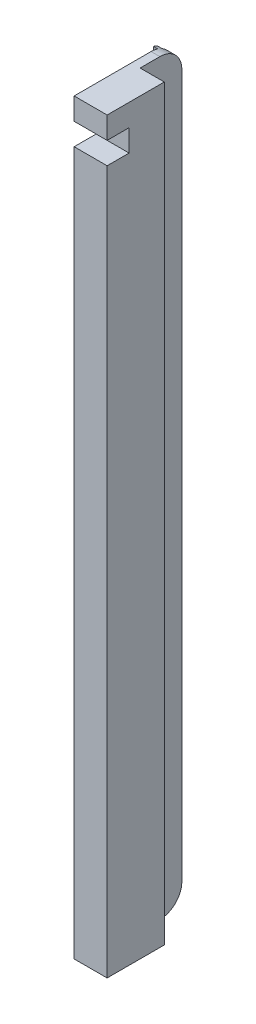
ISO-10303-21;
HEADER;
FILE_DESCRIPTION(('STEP AP214'),'2;1');
FILE_NAME('part.step','',(''),(''),'','','');
FILE_SCHEMA(('AUTOMOTIVE_DESIGN { 1 0 10303 214 1 1 1 1 }'));
ENDSEC;
DATA;
#1=APPLICATION_CONTEXT('core data for automotive mechanical design processes');
#2=APPLICATION_PROTOCOL_DEFINITION('international standard','automotive_design',2000,#1);
#3=PRODUCT_CONTEXT('',#1,'mechanical');
#4=PRODUCT('Part','Part','',(#3));
#5=PRODUCT_RELATED_PRODUCT_CATEGORY('part','',(#4));
#6=PRODUCT_DEFINITION_FORMATION('','',#4);
#7=PRODUCT_DEFINITION_CONTEXT('part definition',#1,'design');
#8=PRODUCT_DEFINITION('design','',#6,#7);
#9=PRODUCT_DEFINITION_SHAPE('','',#8);
#10=(LENGTH_UNIT() NAMED_UNIT(*) SI_UNIT(.MILLI.,.METRE.));
#11=(NAMED_UNIT(*) PLANE_ANGLE_UNIT() SI_UNIT($,.RADIAN.));
#12=(NAMED_UNIT(*) SI_UNIT($,.STERADIAN.) SOLID_ANGLE_UNIT());
#13=UNCERTAINTY_MEASURE_WITH_UNIT(LENGTH_MEASURE(1.E-05),#10,'distance_accuracy_value','');
#14=(GEOMETRIC_REPRESENTATION_CONTEXT(3) GLOBAL_UNCERTAINTY_ASSIGNED_CONTEXT((#13)) GLOBAL_UNIT_ASSIGNED_CONTEXT((#10,
#11,#12)) REPRESENTATION_CONTEXT('',''));
#15=CARTESIAN_POINT('',(0.,0.,0.));
#16=DIRECTION('',(0.,0.,1.));
#17=DIRECTION('',(1.,0.,0.));
#18=AXIS2_PLACEMENT_3D('',#15,#16,#17);
#19=CARTESIAN_POINT('',(168.,-19.9999999999999,26.));
#20=DIRECTION('',(1.,0.,0.));
#21=DIRECTION('',(0.,1.,0.));
#22=AXIS2_PLACEMENT_3D('',#19,#20,#21);
#23=PLANE('',#22);
#24=CARTESIAN_POINT('',(168.,-9.99999999999996,-9.));
#25=DIRECTION('',(1.,0.,0.));
#26=DIRECTION('',(0.,1.,0.));
#27=AXIS2_PLACEMENT_3D('',#24,#25,#26);
#28=CIRCLE('',#27,10.);
#29=CARTESIAN_POINT('',(168.,0.,-9.));
#30=VERTEX_POINT('',#29);
#31=CARTESIAN_POINT('',(168.,-0.460607985830501,-12.));
#32=VERTEX_POINT('',#31);
#33=EDGE_CURVE('E264',#30,#32,#28,.F.);
#34=ORIENTED_EDGE('',*,*,#33,.T.);
#35=DIRECTION('',(0.,-1.,0.));
#36=VECTOR('',#35,1.);
#37=CARTESIAN_POINT('',(168.,0.,-12.));
#38=LINE('',#37,#36);
#39=CARTESIAN_POINT('',(168.,-339.539392014169,-12.));
#40=VERTEX_POINT('',#39);
#41=EDGE_CURVE('E156',#32,#40,#38,.T.);
#42=ORIENTED_EDGE('',*,*,#41,.T.);
#43=CARTESIAN_POINT('',(168.,-330.,-9.));
#44=DIRECTION('',(1.,0.,0.));
#45=DIRECTION('',(0.,1.,0.));
#46=AXIS2_PLACEMENT_3D('',#43,#44,#45);
#47=CIRCLE('',#46,10.);
#48=CARTESIAN_POINT('',(168.,-340.,-8.99999999999998));
#49=VERTEX_POINT('',#48);
#50=EDGE_CURVE('E259',#40,#49,#47,.F.);
#51=ORIENTED_EDGE('',*,*,#50,.T.);
#52=DIRECTION('',(0.,0.,-1.));
#53=VECTOR('',#52,1.);
#54=CARTESIAN_POINT('',(168.,-340.,26.));
#55=LINE('',#54,#53);
#56=CARTESIAN_POINT('',(168.,-340.,26.));
#57=VERTEX_POINT('',#56);
#58=EDGE_CURVE('E240',#57,#49,#55,.T.);
#59=ORIENTED_EDGE('',*,*,#58,.F.);
#60=DIRECTION('',(0.,-1.,0.));
#61=VECTOR('',#60,1.);
#62=CARTESIAN_POINT('',(168.,-19.9999999999999,26.));
#63=LINE('',#62,#61);
#64=CARTESIAN_POINT('',(168.,-19.9999999999999,26.));
#65=VERTEX_POINT('',#64);
#66=EDGE_CURVE('E229',#65,#57,#63,.T.);
#67=ORIENTED_EDGE('',*,*,#66,.F.);
#68=DIRECTION('',(0.,0.,-1.));
#69=VECTOR('',#68,1.);
#70=CARTESIAN_POINT('',(168.,-20.,0.));
#71=LINE('',#70,#69);
#72=CARTESIAN_POINT('',(168.,-20.,15.9999999999999));
#73=VERTEX_POINT('',#72);
#74=EDGE_CURVE('E190',#65,#73,#71,.T.);
#75=ORIENTED_EDGE('',*,*,#74,.T.);
#76=DIRECTION('',(0.,-1.,0.));
#77=VECTOR('',#76,1.);
#78=CARTESIAN_POINT('',(168.,0.,15.9999999999999));
#79=LINE('',#78,#77);
#80=CARTESIAN_POINT('',(168.,-9.99999999999995,15.9999999999999));
#81=VERTEX_POINT('',#80);
#82=EDGE_CURVE('E188',#81,#73,#79,.T.);
#83=ORIENTED_EDGE('',*,*,#82,.F.);
#84=DIRECTION('',(0.,0.,1.));
#85=VECTOR('',#84,1.);
#86=CARTESIAN_POINT('',(168.,-9.99999999999995,0.));
#87=LINE('',#86,#85);
#88=CARTESIAN_POINT('',(168.,-9.99999999999995,26.));
#89=VERTEX_POINT('',#88);
#90=EDGE_CURVE('E160',#81,#89,#87,.T.);
#91=ORIENTED_EDGE('',*,*,#90,.T.);
#92=CARTESIAN_POINT('',(168.,0.,26.));
#93=VERTEX_POINT('',#92);
#94=EDGE_CURVE('E230',#93,#89,#63,.T.);
#95=ORIENTED_EDGE('',*,*,#94,.F.);
#96=DIRECTION('',(0.,0.,1.));
#97=VECTOR('',#96,1.);
#98=CARTESIAN_POINT('',(168.,0.,-19.));
#99=LINE('',#98,#97);
#100=EDGE_CURVE('E211',#30,#93,#99,.T.);
#101=ORIENTED_EDGE('',*,*,#100,.F.);
#102=EDGE_LOOP('',(#34,#42,#51,#59,#67,#75,#83,#91,#95,#101));
#103=FACE_BOUND('',#102,.T.);
#104=ADVANCED_FACE('F35',(#103),#23,.F.);
#105=CARTESIAN_POINT('',(0.,0.,26.));
#106=DIRECTION('',(0.,0.,1.));
#107=DIRECTION('',(1.,0.,0.));
#108=AXIS2_PLACEMENT_3D('',#105,#106,#107);
#109=PLANE('',#108);
#110=ORIENTED_EDGE('',*,*,#94,.T.);
#111=DIRECTION('',(-1.,0.,0.));
#112=VECTOR('',#111,1.);
#113=CARTESIAN_POINT('',(569.,-9.99999999999992,26.));
#114=LINE('',#113,#112);
#115=CARTESIAN_POINT('',(183.,-9.99999999999995,26.));
#116=VERTEX_POINT('',#115);
#117=EDGE_CURVE('E194',#116,#89,#114,.T.);
#118=ORIENTED_EDGE('',*,*,#117,.F.);
#119=DIRECTION('',(0.,-1.,0.));
#120=VECTOR('',#119,1.);
#121=CARTESIAN_POINT('',(183.,0.,26.));
#122=LINE('',#121,#120);
#123=CARTESIAN_POINT('',(183.,0.,26.));
#124=VERTEX_POINT('',#123);
#125=EDGE_CURVE('E223',#124,#116,#122,.T.);
#126=ORIENTED_EDGE('',*,*,#125,.F.);
#127=DIRECTION('',(-1.,0.,0.));
#128=VECTOR('',#127,1.);
#129=CARTESIAN_POINT('',(-168.,0.,26.));
#130=LINE('',#129,#128);
#131=EDGE_CURVE('E218',#124,#93,#130,.T.);
#132=ORIENTED_EDGE('',*,*,#131,.T.);
#133=EDGE_LOOP('',(#110,#118,#126,#132));
#134=FACE_BOUND('',#133,.T.);
#135=ADVANCED_FACE('F297',(#134),#109,.T.);
#136=CARTESIAN_POINT('',(183.,-19.9999999999999,26.));
#137=VERTEX_POINT('',#136);
#138=CARTESIAN_POINT('',(183.,-340.,26.));
#139=VERTEX_POINT('',#138);
#140=EDGE_CURVE('E221',#137,#139,#122,.T.);
#141=ORIENTED_EDGE('',*,*,#140,.F.);
#142=DIRECTION('',(-1.,0.,0.));
#143=VECTOR('',#142,1.);
#144=CARTESIAN_POINT('',(569.,-19.9999999999999,26.));
#145=LINE('',#144,#143);
#146=EDGE_CURVE('E197',#137,#65,#145,.T.);
#147=ORIENTED_EDGE('',*,*,#146,.T.);
#148=ORIENTED_EDGE('',*,*,#66,.T.);
#149=DIRECTION('',(-1.,0.,0.));
#150=VECTOR('',#149,1.);
#151=CARTESIAN_POINT('',(183.,-340.,26.));
#152=LINE('',#151,#150);
#153=EDGE_CURVE('E226',#139,#57,#152,.T.);
#154=ORIENTED_EDGE('',*,*,#153,.F.);
#155=EDGE_LOOP('',(#141,#147,#148,#154));
#156=FACE_BOUND('',#155,.T.);
#157=ADVANCED_FACE('F278',(#156),#109,.T.);
#158=CARTESIAN_POINT('',(168.,-330.,-19.));
#159=VERTEX_POINT('',#158);
#160=CARTESIAN_POINT('',(168.,-338.660254037844,-14.));
#161=VERTEX_POINT('',#160);
#162=EDGE_CURVE('E260',#159,#161,#47,.F.);
#163=ORIENTED_EDGE('',*,*,#162,.T.);
#164=DIRECTION('',(0.,1.,0.));
#165=VECTOR('',#164,1.);
#166=CARTESIAN_POINT('',(168.,0.,-14.));
#167=LINE('',#166,#165);
#168=CARTESIAN_POINT('',(168.,-1.33974596215557,-14.));
#169=VERTEX_POINT('',#168);
#170=EDGE_CURVE('E174',#161,#169,#167,.T.);
#171=ORIENTED_EDGE('',*,*,#170,.T.);
#172=CARTESIAN_POINT('',(168.,-9.99999999999996,-19.));
#173=VERTEX_POINT('',#172);
#174=EDGE_CURVE('E263',#169,#173,#28,.F.);
#175=ORIENTED_EDGE('',*,*,#174,.T.);
#176=DIRECTION('',(0.,1.,0.));
#177=VECTOR('',#176,1.);
#178=CARTESIAN_POINT('',(168.,0.,-19.));
#179=LINE('',#178,#177);
#180=EDGE_CURVE('E202',#159,#173,#179,.T.);
#181=ORIENTED_EDGE('',*,*,#180,.F.);
#182=EDGE_LOOP('',(#163,#171,#175,#181));
#183=FACE_BOUND('',#182,.T.);
#184=ADVANCED_FACE('F319',(#183),#23,.F.);
#185=CARTESIAN_POINT('',(183.,0.,26.));
#186=DIRECTION('',(1.,0.,0.));
#187=DIRECTION('',(0.,1.,0.));
#188=AXIS2_PLACEMENT_3D('',#185,#186,#187);
#189=PLANE('',#188);
#190=ORIENTED_EDGE('',*,*,#125,.T.);
#191=DIRECTION('',(0.,0.,-1.));
#192=VECTOR('',#191,1.);
#193=CARTESIAN_POINT('',(183.,-9.99999999999995,26.));
#194=LINE('',#193,#192);
#195=CARTESIAN_POINT('',(183.,-9.99999999999995,15.9999999999999));
#196=VERTEX_POINT('',#195);
#197=EDGE_CURVE('E11',#116,#196,#194,.T.);
#198=ORIENTED_EDGE('',*,*,#197,.T.);
#199=DIRECTION('',(0.,1.,0.));
#200=VECTOR('',#199,1.);
#201=CARTESIAN_POINT('',(183.,0.,15.9999999999999));
#202=LINE('',#201,#200);
#203=CARTESIAN_POINT('',(183.,-20.,15.9999999999999));
#204=VERTEX_POINT('',#203);
#205=EDGE_CURVE('E268',#204,#196,#202,.T.);
#206=ORIENTED_EDGE('',*,*,#205,.F.);
#207=DIRECTION('',(0.,0.,1.));
#208=VECTOR('',#207,1.);
#209=CARTESIAN_POINT('',(183.,-19.9999999999999,26.));
#210=LINE('',#209,#208);
#211=EDGE_CURVE('E43',#204,#137,#210,.T.);
#212=ORIENTED_EDGE('',*,*,#211,.T.);
#213=ORIENTED_EDGE('',*,*,#140,.T.);
#214=DIRECTION('',(0.,0.,-1.));
#215=VECTOR('',#214,1.);
#216=CARTESIAN_POINT('',(183.,-340.,26.));
#217=LINE('',#216,#215);
#218=CARTESIAN_POINT('',(183.,-340.,0.));
#219=VERTEX_POINT('',#218);
#220=EDGE_CURVE('E244',#139,#219,#217,.T.);
#221=ORIENTED_EDGE('',*,*,#220,.T.);
#222=DIRECTION('',(0.,-1.,0.));
#223=VECTOR('',#222,1.);
#224=CARTESIAN_POINT('',(183.,0.,0.));
#225=LINE('',#224,#223);
#226=CARTESIAN_POINT('',(183.,0.,0.));
#227=VERTEX_POINT('',#226);
#228=EDGE_CURVE('E235',#227,#219,#225,.T.);
#229=ORIENTED_EDGE('',*,*,#228,.F.);
#230=DIRECTION('',(0.,0.,-1.));
#231=VECTOR('',#230,1.);
#232=CARTESIAN_POINT('',(183.,0.,26.));
#233=LINE('',#232,#231);
#234=EDGE_CURVE('E233',#124,#227,#233,.T.);
#235=ORIENTED_EDGE('',*,*,#234,.F.);
#236=EDGE_LOOP('',(#190,#198,#206,#212,#213,#221,#229,#235));
#237=FACE_BOUND('',#236,.T.);
#238=ADVANCED_FACE('F273',(#237),#189,.T.);
#239=CARTESIAN_POINT('',(168.,0.,26.));
#240=DIRECTION('',(0.,1.,0.));
#241=DIRECTION('',(-1.,0.,0.));
#242=AXIS2_PLACEMENT_3D('',#239,#240,#241);
#243=PLANE('',#242);
#244=ORIENTED_EDGE('',*,*,#100,.T.);
#245=ORIENTED_EDGE('',*,*,#131,.F.);
#246=ORIENTED_EDGE('',*,*,#234,.T.);
#247=DIRECTION('',(1.,0.,0.));
#248=VECTOR('',#247,1.);
#249=CARTESIAN_POINT('',(168.,0.,0.));
#250=LINE('',#249,#248);
#251=CARTESIAN_POINT('',(172.,0.,0.));
#252=VERTEX_POINT('',#251);
#253=EDGE_CURVE('E214',#252,#227,#250,.T.);
#254=ORIENTED_EDGE('',*,*,#253,.F.);
#255=DIRECTION('',(0.,0.,1.));
#256=VECTOR('',#255,1.);
#257=CARTESIAN_POINT('',(172.,0.,-19.));
#258=LINE('',#257,#256);
#259=CARTESIAN_POINT('',(172.,0.,-9.));
#260=VERTEX_POINT('',#259);
#261=EDGE_CURVE('E215',#260,#252,#258,.T.);
#262=ORIENTED_EDGE('',*,*,#261,.F.);
#263=DIRECTION('',(1.,0.,0.));
#264=VECTOR('',#263,1.);
#265=CARTESIAN_POINT('',(168.,0.,-9.));
#266=LINE('',#265,#264);
#267=EDGE_CURVE('E243',#260,#30,#266,.F.);
#268=ORIENTED_EDGE('',*,*,#267,.T.);
#269=EDGE_LOOP('',(#244,#245,#246,#254,#262,#268));
#270=FACE_BOUND('',#269,.T.);
#271=ADVANCED_FACE('F294',(#270),#243,.T.);
#272=CARTESIAN_POINT('',(0.,-9.99999999999998,-9.));
#273=DIRECTION('',(-1.,0.,0.));
#274=DIRECTION('',(0.,-1.,0.));
#275=AXIS2_PLACEMENT_3D('',#272,#273,#274);
#276=CYLINDRICAL_SURFACE('',#275,10.);
#277=DIRECTION('',(1.,0.,0.));
#278=VECTOR('',#277,1.);
#279=CARTESIAN_POINT('',(172.,-9.99999999999996,-19.));
#280=LINE('',#279,#278);
#281=CARTESIAN_POINT('',(172.,-9.99999999999996,-19.));
#282=VERTEX_POINT('',#281);
#283=EDGE_CURVE('E252',#173,#282,#280,.T.);
#284=ORIENTED_EDGE('',*,*,#283,.F.);
#285=ORIENTED_EDGE('',*,*,#174,.F.);
#286=DIRECTION('',(1.,0.,0.));
#287=VECTOR('',#286,1.);
#288=CARTESIAN_POINT('',(166.,-1.33974596215557,-14.));
#289=LINE('',#288,#287);
#290=CARTESIAN_POINT('',(166.,-1.33974596215557,-14.));
#291=VERTEX_POINT('',#290);
#292=EDGE_CURVE('E50',#291,#169,#289,.T.);
#293=ORIENTED_EDGE('',*,*,#292,.F.);
#294=CARTESIAN_POINT('',(166.,-9.99999999999996,-9.));
#295=DIRECTION('',(-1.,0.,0.));
#296=DIRECTION('',(0.,-1.,0.));
#297=AXIS2_PLACEMENT_3D('',#294,#295,#296);
#298=CIRCLE('',#297,10.);
#299=CARTESIAN_POINT('',(166.,-0.460607985830501,-12.));
#300=VERTEX_POINT('',#299);
#301=EDGE_CURVE('E162',#300,#291,#298,.T.);
#302=ORIENTED_EDGE('',*,*,#301,.F.);
#303=DIRECTION('',(1.,0.,0.));
#304=VECTOR('',#303,1.);
#305=CARTESIAN_POINT('',(166.,-0.460607985830501,-12.));
#306=LINE('',#305,#304);
#307=EDGE_CURVE('E150',#300,#32,#306,.T.);
#308=ORIENTED_EDGE('',*,*,#307,.T.);
#309=ORIENTED_EDGE('',*,*,#33,.F.);
#310=ORIENTED_EDGE('',*,*,#267,.F.);
#311=CARTESIAN_POINT('',(172.,-9.99999999999996,-9.));
#312=DIRECTION('',(1.,0.,0.));
#313=DIRECTION('',(0.,1.,0.));
#314=AXIS2_PLACEMENT_3D('',#311,#312,#313);
#315=CIRCLE('',#314,10.);
#316=EDGE_CURVE('E257',#282,#260,#315,.T.);
#317=ORIENTED_EDGE('',*,*,#316,.F.);
#318=EDGE_LOOP('',(#284,#285,#293,#302,#308,#309,#310,#317));
#319=FACE_BOUND('',#318,.T.);
#320=ADVANCED_FACE('F164',(#319),#276,.T.);
#321=CARTESIAN_POINT('',(0.,-330.,-9.));
#322=DIRECTION('',(1.,0.,0.));
#323=DIRECTION('',(0.,0.,-1.));
#324=AXIS2_PLACEMENT_3D('',#321,#322,#323);
#325=CYLINDRICAL_SURFACE('',#324,10.);
#326=DIRECTION('',(-1.,0.,0.));
#327=VECTOR('',#326,1.);
#328=CARTESIAN_POINT('',(172.,-340.,-9.));
#329=LINE('',#328,#327);
#330=CARTESIAN_POINT('',(172.,-340.,-9.));
#331=VERTEX_POINT('',#330);
#332=EDGE_CURVE('E266',#49,#331,#329,.F.);
#333=ORIENTED_EDGE('',*,*,#332,.F.);
#334=ORIENTED_EDGE('',*,*,#50,.F.);
#335=DIRECTION('',(1.,0.,0.));
#336=VECTOR('',#335,1.);
#337=CARTESIAN_POINT('',(166.,-339.539392014169,-12.));
#338=LINE('',#337,#336);
#339=CARTESIAN_POINT('',(166.,-339.539392014169,-12.));
#340=VERTEX_POINT('',#339);
#341=EDGE_CURVE('E180',#340,#40,#338,.T.);
#342=ORIENTED_EDGE('',*,*,#341,.F.);
#343=CARTESIAN_POINT('',(166.,-330.,-9.));
#344=DIRECTION('',(-1.,0.,0.));
#345=DIRECTION('',(0.,-1.,0.));
#346=AXIS2_PLACEMENT_3D('',#343,#344,#345);
#347=CIRCLE('',#346,10.);
#348=CARTESIAN_POINT('',(166.,-338.660254037844,-14.));
#349=VERTEX_POINT('',#348);
#350=EDGE_CURVE('E172',#349,#340,#347,.T.);
#351=ORIENTED_EDGE('',*,*,#350,.F.);
#352=DIRECTION('',(1.,0.,0.));
#353=VECTOR('',#352,1.);
#354=CARTESIAN_POINT('',(166.,-338.660254037844,-14.));
#355=LINE('',#354,#353);
#356=EDGE_CURVE('E183',#349,#161,#355,.T.);
#357=ORIENTED_EDGE('',*,*,#356,.T.);
#358=ORIENTED_EDGE('',*,*,#162,.F.);
#359=DIRECTION('',(-1.,0.,0.));
#360=VECTOR('',#359,1.);
#361=CARTESIAN_POINT('',(168.,-330.,-19.));
#362=LINE('',#361,#360);
#363=CARTESIAN_POINT('',(172.,-330.,-19.));
#364=VERTEX_POINT('',#363);
#365=EDGE_CURVE('E249',#364,#159,#362,.T.);
#366=ORIENTED_EDGE('',*,*,#365,.F.);
#367=CARTESIAN_POINT('',(172.,-330.,-9.));
#368=DIRECTION('',(1.,0.,0.));
#369=DIRECTION('',(0.,1.,0.));
#370=AXIS2_PLACEMENT_3D('',#367,#368,#369);
#371=CIRCLE('',#370,10.);
#372=EDGE_CURVE('E255',#331,#364,#371,.T.);
#373=ORIENTED_EDGE('',*,*,#372,.F.);
#374=EDGE_LOOP('',(#333,#334,#342,#351,#357,#358,#366,#373));
#375=FACE_BOUND('',#374,.T.);
#376=ADVANCED_FACE('F37',(#375),#325,.T.);
#377=CARTESIAN_POINT('',(183.,-340.,26.));
#378=DIRECTION('',(0.,-1.,0.));
#379=DIRECTION('',(0.,0.,-1.));
#380=AXIS2_PLACEMENT_3D('',#377,#378,#379);
#381=PLANE('',#380);
#382=ORIENTED_EDGE('',*,*,#58,.T.);
#383=ORIENTED_EDGE('',*,*,#332,.T.);
#384=DIRECTION('',(0.,0.,1.));
#385=VECTOR('',#384,1.);
#386=CARTESIAN_POINT('',(172.,-340.,-19.));
#387=LINE('',#386,#385);
#388=CARTESIAN_POINT('',(172.,-340.,0.));
#389=VERTEX_POINT('',#388);
#390=EDGE_CURVE('E208',#331,#389,#387,.T.);
#391=ORIENTED_EDGE('',*,*,#390,.T.);
#392=DIRECTION('',(-1.,0.,0.));
#393=VECTOR('',#392,1.);
#394=CARTESIAN_POINT('',(183.,-340.,0.));
#395=LINE('',#394,#393);
#396=EDGE_CURVE('E222',#219,#389,#395,.T.);
#397=ORIENTED_EDGE('',*,*,#396,.F.);
#398=ORIENTED_EDGE('',*,*,#220,.F.);
#399=ORIENTED_EDGE('',*,*,#153,.T.);
#400=EDGE_LOOP('',(#382,#383,#391,#397,#398,#399));
#401=FACE_BOUND('',#400,.T.);
#402=ADVANCED_FACE('F282',(#401),#381,.T.);
#403=CARTESIAN_POINT('',(0.,0.,0.));
#404=DIRECTION('',(0.,0.,1.));
#405=DIRECTION('',(1.,0.,0.));
#406=AXIS2_PLACEMENT_3D('',#403,#404,#405);
#407=PLANE('',#406);
#408=ORIENTED_EDGE('',*,*,#396,.T.);
#409=DIRECTION('',(0.,1.,0.));
#410=VECTOR('',#409,1.);
#411=CARTESIAN_POINT('',(172.,0.,0.));
#412=LINE('',#411,#410);
#413=EDGE_CURVE('E196',#389,#252,#412,.T.);
#414=ORIENTED_EDGE('',*,*,#413,.T.);
#415=ORIENTED_EDGE('',*,*,#253,.T.);
#416=ORIENTED_EDGE('',*,*,#228,.T.);
#417=EDGE_LOOP('',(#408,#414,#415,#416));
#418=FACE_BOUND('',#417,.T.);
#419=ADVANCED_FACE('F289',(#418),#407,.F.);
#420=CARTESIAN_POINT('',(172.,0.,-19.));
#421=DIRECTION('',(1.,0.,0.));
#422=DIRECTION('',(0.,1.,0.));
#423=AXIS2_PLACEMENT_3D('',#420,#421,#422);
#424=PLANE('',#423);
#425=DIRECTION('',(0.,1.,0.));
#426=VECTOR('',#425,1.);
#427=CARTESIAN_POINT('',(172.,0.,-19.));
#428=LINE('',#427,#426);
#429=EDGE_CURVE('E205',#364,#282,#428,.T.);
#430=ORIENTED_EDGE('',*,*,#429,.T.);
#431=ORIENTED_EDGE('',*,*,#316,.T.);
#432=ORIENTED_EDGE('',*,*,#261,.T.);
#433=ORIENTED_EDGE('',*,*,#413,.F.);
#434=ORIENTED_EDGE('',*,*,#390,.F.);
#435=ORIENTED_EDGE('',*,*,#372,.T.);
#436=EDGE_LOOP('',(#430,#431,#432,#433,#434,#435));
#437=FACE_BOUND('',#436,.T.);
#438=ADVANCED_FACE('F340',(#437),#424,.T.);
#439=CARTESIAN_POINT('',(0.,0.,-19.));
#440=DIRECTION('',(0.,0.,1.));
#441=DIRECTION('',(1.,0.,0.));
#442=AXIS2_PLACEMENT_3D('',#439,#440,#441);
#443=PLANE('',#442);
#444=ORIENTED_EDGE('',*,*,#180,.T.);
#445=ORIENTED_EDGE('',*,*,#283,.T.);
#446=ORIENTED_EDGE('',*,*,#429,.F.);
#447=ORIENTED_EDGE('',*,*,#365,.T.);
#448=EDGE_LOOP('',(#444,#445,#446,#447));
#449=FACE_BOUND('',#448,.T.);
#450=ADVANCED_FACE('F314',(#449),#443,.F.);
#451=CARTESIAN_POINT('',(569.,-9.99999999999992,0.));
#452=DIRECTION('',(0.,-1.,0.));
#453=DIRECTION('',(1.,0.,0.));
#454=AXIS2_PLACEMENT_3D('',#451,#452,#453);
#455=PLANE('',#454);
#456=ORIENTED_EDGE('',*,*,#117,.T.);
#457=ORIENTED_EDGE('',*,*,#90,.F.);
#458=DIRECTION('',(-1.,0.,0.));
#459=VECTOR('',#458,1.);
#460=CARTESIAN_POINT('',(569.,-9.99999999999992,15.9999999999999));
#461=LINE('',#460,#459);
#462=EDGE_CURVE('E193',#196,#81,#461,.T.);
#463=ORIENTED_EDGE('',*,*,#462,.F.);
#464=ORIENTED_EDGE('',*,*,#197,.F.);
#465=EDGE_LOOP('',(#456,#457,#463,#464));
#466=FACE_BOUND('',#465,.T.);
#467=ADVANCED_FACE('F301',(#466),#455,.T.);
#468=CARTESIAN_POINT('',(569.,-19.9999999999999,0.));
#469=DIRECTION('',(0.,1.,0.));
#470=DIRECTION('',(0.,0.,1.));
#471=AXIS2_PLACEMENT_3D('',#468,#469,#470);
#472=PLANE('',#471);
#473=DIRECTION('',(-1.,0.,0.));
#474=VECTOR('',#473,1.);
#475=CARTESIAN_POINT('',(569.,-19.9999999999999,15.9999999999999));
#476=LINE('',#475,#474);
#477=EDGE_CURVE('E58',#204,#73,#476,.T.);
#478=ORIENTED_EDGE('',*,*,#477,.T.);
#479=ORIENTED_EDGE('',*,*,#74,.F.);
#480=ORIENTED_EDGE('',*,*,#146,.F.);
#481=ORIENTED_EDGE('',*,*,#211,.F.);
#482=EDGE_LOOP('',(#478,#479,#480,#481));
#483=FACE_BOUND('',#482,.T.);
#484=ADVANCED_FACE('F306',(#483),#472,.T.);
#485=CARTESIAN_POINT('',(569.,0.,15.9999999999999));
#486=DIRECTION('',(0.,0.,-1.));
#487=DIRECTION('',(-1.,0.,0.));
#488=AXIS2_PLACEMENT_3D('',#485,#486,#487);
#489=PLANE('',#488);
#490=ORIENTED_EDGE('',*,*,#205,.T.);
#491=ORIENTED_EDGE('',*,*,#462,.T.);
#492=ORIENTED_EDGE('',*,*,#82,.T.);
#493=ORIENTED_EDGE('',*,*,#477,.F.);
#494=EDGE_LOOP('',(#490,#491,#492,#493));
#495=FACE_BOUND('',#494,.T.);
#496=ADVANCED_FACE('F304',(#495),#489,.F.);
#497=CARTESIAN_POINT('',(166.,0.,-12.));
#498=DIRECTION('',(0.,0.,1.));
#499=DIRECTION('',(0.,-1.,0.));
#500=AXIS2_PLACEMENT_3D('',#497,#498,#499);
#501=PLANE('',#500);
#502=ORIENTED_EDGE('',*,*,#41,.F.);
#503=ORIENTED_EDGE('',*,*,#307,.F.);
#504=DIRECTION('',(0.,-1.,0.));
#505=VECTOR('',#504,1.);
#506=CARTESIAN_POINT('',(166.,0.,-12.));
#507=LINE('',#506,#505);
#508=EDGE_CURVE('E154',#300,#340,#507,.T.);
#509=ORIENTED_EDGE('',*,*,#508,.T.);
#510=ORIENTED_EDGE('',*,*,#341,.T.);
#511=EDGE_LOOP('',(#502,#503,#509,#510));
#512=FACE_BOUND('',#511,.T.);
#513=ADVANCED_FACE('F152',(#512),#501,.T.);
#514=CARTESIAN_POINT('',(166.,0.,-14.));
#515=DIRECTION('',(0.,0.,-1.));
#516=DIRECTION('',(-1.,0.,0.));
#517=AXIS2_PLACEMENT_3D('',#514,#515,#516);
#518=PLANE('',#517);
#519=ORIENTED_EDGE('',*,*,#170,.F.);
#520=ORIENTED_EDGE('',*,*,#356,.F.);
#521=DIRECTION('',(0.,1.,0.));
#522=VECTOR('',#521,1.);
#523=CARTESIAN_POINT('',(166.,0.,-14.));
#524=LINE('',#523,#522);
#525=EDGE_CURVE('E168',#349,#291,#524,.T.);
#526=ORIENTED_EDGE('',*,*,#525,.T.);
#527=ORIENTED_EDGE('',*,*,#292,.T.);
#528=EDGE_LOOP('',(#519,#520,#526,#527));
#529=FACE_BOUND('',#528,.T.);
#530=ADVANCED_FACE('F344',(#529),#518,.T.);
#531=CARTESIAN_POINT('',(166.,0.,0.));
#532=DIRECTION('',(-1.,0.,0.));
#533=DIRECTION('',(0.,-1.,0.));
#534=AXIS2_PLACEMENT_3D('',#531,#532,#533);
#535=PLANE('',#534);
#536=ORIENTED_EDGE('',*,*,#508,.F.);
#537=ORIENTED_EDGE('',*,*,#301,.T.);
#538=ORIENTED_EDGE('',*,*,#525,.F.);
#539=ORIENTED_EDGE('',*,*,#350,.T.);
#540=EDGE_LOOP('',(#536,#537,#538,#539));
#541=FACE_BOUND('',#540,.T.);
#542=ADVANCED_FACE('F170',(#541),#535,.T.);
#543=CLOSED_SHELL('',(#104,#135,#157,#184,#238,#271,#320,#376,#402,#419,#438,#450,#467,#484,
#496,#513,#530,#542));
#544=MANIFOLD_SOLID_BREP('B2',#543);
#545=ADVANCED_BREP_SHAPE_REPRESENTATION('',(#18,#544),#14);
#546=SHAPE_DEFINITION_REPRESENTATION(#9,#545);
ENDSEC;
END-ISO-10303-21;
